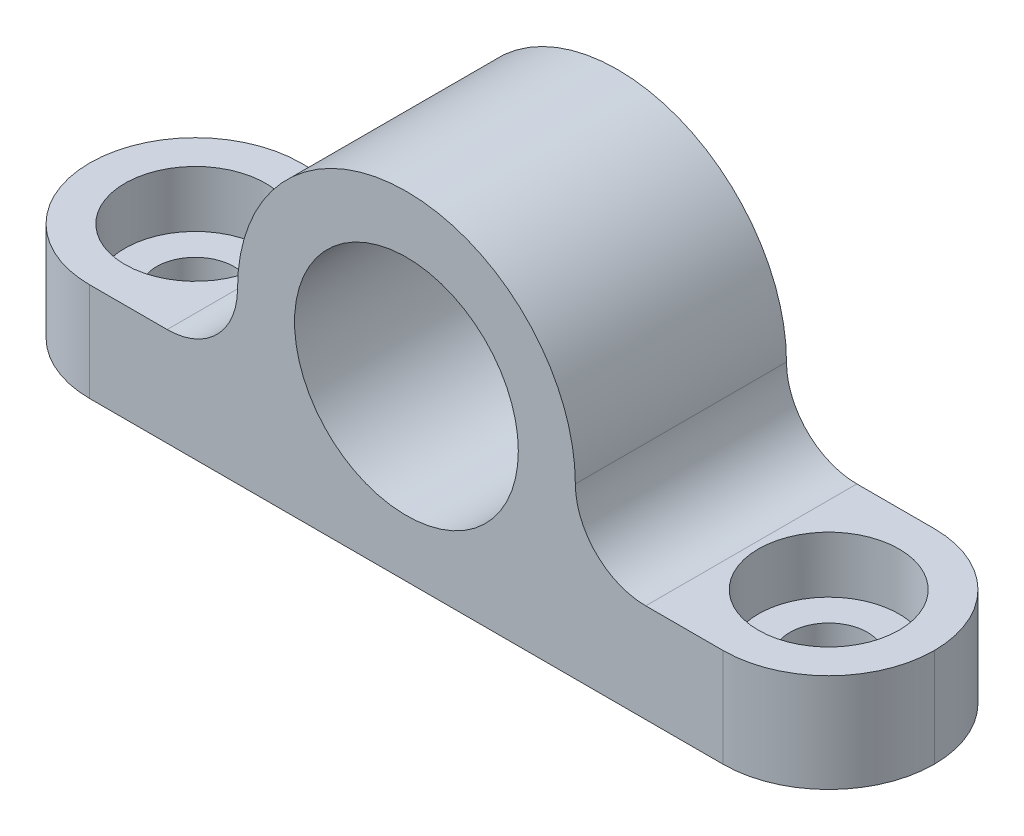
ISO-10303-21;
HEADER;
FILE_DESCRIPTION(('STEP AP214'),'2;1');
FILE_NAME('part.step','',(''),(''),'','','');
FILE_SCHEMA(('AUTOMOTIVE_DESIGN { 1 0 10303 214 1 1 1 1 }'));
ENDSEC;
DATA;
#1=APPLICATION_CONTEXT('core data for automotive mechanical design processes');
#2=APPLICATION_PROTOCOL_DEFINITION('international standard','automotive_design',2000,#1);
#3=PRODUCT_CONTEXT('',#1,'mechanical');
#4=PRODUCT('Part','Part','',(#3));
#5=PRODUCT_RELATED_PRODUCT_CATEGORY('part','',(#4));
#6=PRODUCT_DEFINITION_FORMATION('','',#4);
#7=PRODUCT_DEFINITION_CONTEXT('part definition',#1,'design');
#8=PRODUCT_DEFINITION('design','',#6,#7);
#9=PRODUCT_DEFINITION_SHAPE('','',#8);
#10=(LENGTH_UNIT() NAMED_UNIT(*) SI_UNIT(.MILLI.,.METRE.));
#11=(NAMED_UNIT(*) PLANE_ANGLE_UNIT() SI_UNIT($,.RADIAN.));
#12=(NAMED_UNIT(*) SI_UNIT($,.STERADIAN.) SOLID_ANGLE_UNIT());
#13=UNCERTAINTY_MEASURE_WITH_UNIT(LENGTH_MEASURE(1.E-05),#10,'distance_accuracy_value','');
#14=(GEOMETRIC_REPRESENTATION_CONTEXT(3) GLOBAL_UNCERTAINTY_ASSIGNED_CONTEXT((#13)) GLOBAL_UNIT_ASSIGNED_CONTEXT((#10,
#11,#12)) REPRESENTATION_CONTEXT('',''));
#15=CARTESIAN_POINT('',(0.,0.,0.));
#16=DIRECTION('',(0.,0.,1.));
#17=DIRECTION('',(1.,0.,0.));
#18=AXIS2_PLACEMENT_3D('',#15,#16,#17);
#19=CARTESIAN_POINT('',(30.,7.,7.5));
#20=DIRECTION('',(0.,1.,0.));
#21=DIRECTION('',(0.,0.,1.));
#22=AXIS2_PLACEMENT_3D('',#19,#20,#21);
#23=PLANE('',#22);
#24=CARTESIAN_POINT('',(-22.5,7.,0.));
#25=DIRECTION('',(0.,1.,0.));
#26=DIRECTION('',(0.,0.,1.));
#27=AXIS2_PLACEMENT_3D('',#24,#25,#26);
#28=CIRCLE('',#27,5.);
#29=CARTESIAN_POINT('',(-22.5,7.,5.));
#30=VERTEX_POINT('',#29);
#31=EDGE_CURVE('E157',#30,#30,#28,.T.);
#32=ORIENTED_EDGE('',*,*,#31,.F.);
#33=EDGE_LOOP('',(#32));
#34=FACE_BOUND('',#33,.T.);
#35=DIRECTION('',(-1.,0.,0.));
#36=VECTOR('',#35,1.);
#37=CARTESIAN_POINT('',(-30.,7.,-7.5));
#38=LINE('',#37,#36);
#39=CARTESIAN_POINT('',(-17.,7.,-7.5));
#40=VERTEX_POINT('',#39);
#41=CARTESIAN_POINT('',(-22.5,7.,-7.5));
#42=VERTEX_POINT('',#41);
#43=EDGE_CURVE('E173',#40,#42,#38,.T.);
#44=ORIENTED_EDGE('',*,*,#43,.T.);
#45=CARTESIAN_POINT('',(-22.5,7.,0.));
#46=DIRECTION('',(0.,1.,0.));
#47=DIRECTION('',(0.,0.,1.));
#48=AXIS2_PLACEMENT_3D('',#45,#46,#47);
#49=CIRCLE('',#48,7.5);
#50=CARTESIAN_POINT('',(-30.,7.,0.));
#51=VERTEX_POINT('',#50);
#52=EDGE_CURVE('E12',#42,#51,#49,.T.);
#53=ORIENTED_EDGE('',*,*,#52,.T.);
#54=CARTESIAN_POINT('',(-22.5,7.,0.));
#55=DIRECTION('',(0.,1.,0.));
#56=DIRECTION('',(0.,0.,1.));
#57=AXIS2_PLACEMENT_3D('',#54,#55,#56);
#58=CIRCLE('',#57,7.5);
#59=CARTESIAN_POINT('',(-22.5,7.,7.5));
#60=VERTEX_POINT('',#59);
#61=EDGE_CURVE('E44',#51,#60,#58,.T.);
#62=ORIENTED_EDGE('',*,*,#61,.T.);
#63=DIRECTION('',(1.,0.,0.));
#64=VECTOR('',#63,1.);
#65=CARTESIAN_POINT('',(-30.,7.,7.5));
#66=LINE('',#65,#64);
#67=CARTESIAN_POINT('',(-17.,7.,7.5));
#68=VERTEX_POINT('',#67);
#69=EDGE_CURVE('E174',#60,#68,#66,.T.);
#70=ORIENTED_EDGE('',*,*,#69,.T.);
#71=DIRECTION('',(0.,0.,1.));
#72=VECTOR('',#71,1.);
#73=CARTESIAN_POINT('',(-17.,7.,-45.5131556174964));
#74=LINE('',#73,#72);
#75=EDGE_CURVE('E141',#40,#68,#74,.T.);
#76=ORIENTED_EDGE('',*,*,#75,.F.);
#77=EDGE_LOOP('',(#44,#53,#62,#70,#76));
#78=FACE_BOUND('',#77,.T.);
#79=ADVANCED_FACE('F35',(#34,#78),#23,.T.);
#80=CARTESIAN_POINT('',(22.5,0.,0.));
#81=DIRECTION('',(0.,1.,0.));
#82=DIRECTION('',(0.,0.,1.));
#83=AXIS2_PLACEMENT_3D('',#80,#81,#82);
#84=CYLINDRICAL_SURFACE('',#83,2.75);
#85=CARTESIAN_POINT('',(22.5,0.,0.));
#86=DIRECTION('',(0.,1.,0.));
#87=DIRECTION('',(0.,0.,-1.));
#88=AXIS2_PLACEMENT_3D('',#85,#86,#87);
#89=CIRCLE('',#88,2.75);
#90=CARTESIAN_POINT('',(22.5,0.,-2.75));
#91=VERTEX_POINT('',#90);
#92=EDGE_CURVE('E164',#91,#91,#89,.T.);
#93=ORIENTED_EDGE('',*,*,#92,.F.);
#94=EDGE_LOOP('',(#93));
#95=FACE_BOUND('',#94,.T.);
#96=CARTESIAN_POINT('',(22.5,3.,0.));
#97=DIRECTION('',(0.,1.,0.));
#98=DIRECTION('',(0.,0.,1.));
#99=AXIS2_PLACEMENT_3D('',#96,#97,#98);
#100=CIRCLE('',#99,2.75);
#101=CARTESIAN_POINT('',(22.5,3.,2.75));
#102=VERTEX_POINT('',#101);
#103=EDGE_CURVE('E156',#102,#102,#100,.F.);
#104=ORIENTED_EDGE('',*,*,#103,.F.);
#105=EDGE_LOOP('',(#104));
#106=FACE_BOUND('',#105,.T.);
#107=ADVANCED_FACE('F255',(#95,#106),#84,.F.);
#108=CARTESIAN_POINT('',(-22.5,0.,0.));
#109=DIRECTION('',(0.,1.,0.));
#110=DIRECTION('',(0.,0.,1.));
#111=AXIS2_PLACEMENT_3D('',#108,#109,#110);
#112=CYLINDRICAL_SURFACE('',#111,2.75);
#113=CARTESIAN_POINT('',(-22.5,0.,0.));
#114=DIRECTION('',(0.,1.,0.));
#115=DIRECTION('',(0.,0.,1.));
#116=AXIS2_PLACEMENT_3D('',#113,#114,#115);
#117=CIRCLE('',#116,2.75);
#118=CARTESIAN_POINT('',(-22.5,0.,2.75));
#119=VERTEX_POINT('',#118);
#120=EDGE_CURVE('E167',#119,#119,#117,.T.);
#121=ORIENTED_EDGE('',*,*,#120,.F.);
#122=EDGE_LOOP('',(#121));
#123=FACE_BOUND('',#122,.T.);
#124=CARTESIAN_POINT('',(-22.5,3.,0.));
#125=DIRECTION('',(0.,1.,0.));
#126=DIRECTION('',(0.,0.,1.));
#127=AXIS2_PLACEMENT_3D('',#124,#125,#126);
#128=CIRCLE('',#127,2.75);
#129=CARTESIAN_POINT('',(-22.5,3.,2.75));
#130=VERTEX_POINT('',#129);
#131=EDGE_CURVE('E163',#130,#130,#128,.F.);
#132=ORIENTED_EDGE('',*,*,#131,.F.);
#133=EDGE_LOOP('',(#132));
#134=FACE_BOUND('',#133,.T.);
#135=ADVANCED_FACE('F261',(#123,#134),#112,.F.);
#136=CARTESIAN_POINT('',(-30.,7.,-7.5));
#137=DIRECTION('',(0.,0.,1.));
#138=DIRECTION('',(1.,0.,0.));
#139=AXIS2_PLACEMENT_3D('',#136,#137,#138);
#140=PLANE('',#139);
#141=CARTESIAN_POINT('',(0.,12.,-7.50000000000001));
#142=DIRECTION('',(0.,0.,1.));
#143=DIRECTION('',(1.,0.,0.));
#144=AXIS2_PLACEMENT_3D('',#141,#142,#143);
#145=CIRCLE('',#144,7.9500000000007);
#146=CARTESIAN_POINT('',(7.9500000000007,12.,-7.50000000000001));
#147=VERTEX_POINT('',#146);
#148=EDGE_CURVE('E211',#147,#147,#145,.T.);
#149=ORIENTED_EDGE('',*,*,#148,.T.);
#150=EDGE_LOOP('',(#149));
#151=FACE_BOUND('',#150,.T.);
#152=CARTESIAN_POINT('',(22.5,7.,-7.5));
#153=VERTEX_POINT('',#152);
#154=CARTESIAN_POINT('',(17.,7.,-7.5));
#155=VERTEX_POINT('',#154);
#156=EDGE_CURVE('E171',#153,#155,#38,.T.);
#157=ORIENTED_EDGE('',*,*,#156,.F.);
#158=DIRECTION('',(0.,-1.,0.));
#159=VECTOR('',#158,1.);
#160=CARTESIAN_POINT('',(22.5,7.,-7.5));
#161=LINE('',#160,#159);
#162=CARTESIAN_POINT('',(22.5,0.,-7.5));
#163=VERTEX_POINT('',#162);
#164=EDGE_CURVE('E202',#153,#163,#161,.T.);
#165=ORIENTED_EDGE('',*,*,#164,.T.);
#166=DIRECTION('',(-1.,0.,0.));
#167=VECTOR('',#166,1.);
#168=CARTESIAN_POINT('',(-30.,0.,-7.5));
#169=LINE('',#168,#167);
#170=CARTESIAN_POINT('',(-22.5,0.,-7.5));
#171=VERTEX_POINT('',#170);
#172=EDGE_CURVE('E170',#163,#171,#169,.T.);
#173=ORIENTED_EDGE('',*,*,#172,.T.);
#174=DIRECTION('',(0.,-1.,0.));
#175=VECTOR('',#174,1.);
#176=CARTESIAN_POINT('',(-22.5,7.,-7.5));
#177=LINE('',#176,#175);
#178=EDGE_CURVE('E200',#171,#42,#177,.F.);
#179=ORIENTED_EDGE('',*,*,#178,.T.);
#180=ORIENTED_EDGE('',*,*,#43,.F.);
#181=CARTESIAN_POINT('',(-17.,12.,-7.5));
#182=DIRECTION('',(0.,0.,1.));
#183=DIRECTION('',(1.,0.,0.));
#184=AXIS2_PLACEMENT_3D('',#181,#182,#183);
#185=CIRCLE('',#184,5.);
#186=CARTESIAN_POINT('',(-12.,12.,-7.5));
#187=VERTEX_POINT('',#186);
#188=EDGE_CURVE('E153',#40,#187,#185,.T.);
#189=ORIENTED_EDGE('',*,*,#188,.T.);
#190=CARTESIAN_POINT('',(0.,12.,-7.5));
#191=DIRECTION('',(0.,0.,1.));
#192=DIRECTION('',(1.,0.,0.));
#193=AXIS2_PLACEMENT_3D('',#190,#191,#192);
#194=CIRCLE('',#193,12.);
#195=CARTESIAN_POINT('',(12.,12.,-7.5));
#196=VERTEX_POINT('',#195);
#197=EDGE_CURVE('E227',#187,#196,#194,.F.);
#198=ORIENTED_EDGE('',*,*,#197,.T.);
#199=CARTESIAN_POINT('',(17.,12.,-7.5));
#200=DIRECTION('',(0.,0.,1.));
#201=DIRECTION('',(1.,0.,0.));
#202=AXIS2_PLACEMENT_3D('',#199,#200,#201);
#203=CIRCLE('',#202,5.);
#204=EDGE_CURVE('E119',#196,#155,#203,.T.);
#205=ORIENTED_EDGE('',*,*,#204,.T.);
#206=EDGE_LOOP('',(#157,#165,#173,#179,#180,#189,#198,#205));
#207=FACE_BOUND('',#206,.T.);
#208=ADVANCED_FACE('F231',(#151,#207),#140,.F.);
#209=CARTESIAN_POINT('',(-30.,7.,7.5));
#210=DIRECTION('',(0.,0.,-1.));
#211=DIRECTION('',(-1.,0.,0.));
#212=AXIS2_PLACEMENT_3D('',#209,#210,#211);
#213=PLANE('',#212);
#214=CARTESIAN_POINT('',(0.,12.,7.5));
#215=DIRECTION('',(0.,0.,1.));
#216=DIRECTION('',(1.,0.,0.));
#217=AXIS2_PLACEMENT_3D('',#214,#215,#216);
#218=CIRCLE('',#217,7.9500000000007);
#219=CARTESIAN_POINT('',(7.9500000000007,12.,7.5));
#220=VERTEX_POINT('',#219);
#221=EDGE_CURVE('E206',#220,#220,#218,.T.);
#222=ORIENTED_EDGE('',*,*,#221,.F.);
#223=EDGE_LOOP('',(#222));
#224=FACE_BOUND('',#223,.T.);
#225=DIRECTION('',(1.,0.,0.));
#226=VECTOR('',#225,1.);
#227=CARTESIAN_POINT('',(-30.,0.,7.5));
#228=LINE('',#227,#226);
#229=CARTESIAN_POINT('',(-22.5,0.,7.5));
#230=VERTEX_POINT('',#229);
#231=CARTESIAN_POINT('',(22.5,0.,7.5));
#232=VERTEX_POINT('',#231);
#233=EDGE_CURVE('E179',#230,#232,#228,.T.);
#234=ORIENTED_EDGE('',*,*,#233,.T.);
#235=DIRECTION('',(0.,-1.,0.));
#236=VECTOR('',#235,1.);
#237=CARTESIAN_POINT('',(22.5,7.,7.5));
#238=LINE('',#237,#236);
#239=CARTESIAN_POINT('',(22.5,7.,7.5));
#240=VERTEX_POINT('',#239);
#241=EDGE_CURVE('E194',#232,#240,#238,.F.);
#242=ORIENTED_EDGE('',*,*,#241,.T.);
#243=CARTESIAN_POINT('',(17.,7.,7.5));
#244=VERTEX_POINT('',#243);
#245=EDGE_CURVE('E135',#244,#240,#66,.T.);
#246=ORIENTED_EDGE('',*,*,#245,.F.);
#247=CARTESIAN_POINT('',(17.,12.,7.5));
#248=DIRECTION('',(0.,0.,-1.));
#249=DIRECTION('',(1.,0.,0.));
#250=AXIS2_PLACEMENT_3D('',#247,#248,#249);
#251=CIRCLE('',#250,5.);
#252=CARTESIAN_POINT('',(12.,12.,7.5));
#253=VERTEX_POINT('',#252);
#254=EDGE_CURVE('E117',#244,#253,#251,.T.);
#255=ORIENTED_EDGE('',*,*,#254,.T.);
#256=CARTESIAN_POINT('',(0.,12.,7.5));
#257=DIRECTION('',(0.,0.,1.));
#258=DIRECTION('',(-1.,0.,0.));
#259=AXIS2_PLACEMENT_3D('',#256,#257,#258);
#260=CIRCLE('',#259,12.);
#261=CARTESIAN_POINT('',(-12.,12.,7.5));
#262=VERTEX_POINT('',#261);
#263=EDGE_CURVE('E132',#253,#262,#260,.T.);
#264=ORIENTED_EDGE('',*,*,#263,.T.);
#265=CARTESIAN_POINT('',(-17.,12.,7.5));
#266=DIRECTION('',(0.,0.,-1.));
#267=DIRECTION('',(-1.,0.,0.));
#268=AXIS2_PLACEMENT_3D('',#265,#266,#267);
#269=CIRCLE('',#268,5.);
#270=EDGE_CURVE('E136',#262,#68,#269,.T.);
#271=ORIENTED_EDGE('',*,*,#270,.T.);
#272=ORIENTED_EDGE('',*,*,#69,.F.);
#273=DIRECTION('',(0.,-1.,0.));
#274=VECTOR('',#273,1.);
#275=CARTESIAN_POINT('',(-22.5,7.,7.5));
#276=LINE('',#275,#274);
#277=EDGE_CURVE('E192',#60,#230,#276,.T.);
#278=ORIENTED_EDGE('',*,*,#277,.T.);
#279=EDGE_LOOP('',(#234,#242,#246,#255,#264,#271,#272,#278));
#280=FACE_BOUND('',#279,.T.);
#281=ADVANCED_FACE('F130',(#224,#280),#213,.F.);
#282=ORIENTED_EDGE('',*,*,#245,.T.);
#283=CARTESIAN_POINT('',(22.5,7.,0.));
#284=DIRECTION('',(0.,1.,0.));
#285=DIRECTION('',(0.,0.,1.));
#286=AXIS2_PLACEMENT_3D('',#283,#284,#285);
#287=CIRCLE('',#286,7.5);
#288=CARTESIAN_POINT('',(30.,7.,0.));
#289=VERTEX_POINT('',#288);
#290=EDGE_CURVE('E198',#240,#289,#287,.T.);
#291=ORIENTED_EDGE('',*,*,#290,.T.);
#292=CARTESIAN_POINT('',(22.5,7.,0.));
#293=DIRECTION('',(0.,1.,0.));
#294=DIRECTION('',(0.,0.,1.));
#295=AXIS2_PLACEMENT_3D('',#292,#293,#294);
#296=CIRCLE('',#295,7.5);
#297=EDGE_CURVE('E196',#289,#153,#296,.T.);
#298=ORIENTED_EDGE('',*,*,#297,.T.);
#299=ORIENTED_EDGE('',*,*,#156,.T.);
#300=DIRECTION('',(0.,0.,1.));
#301=VECTOR('',#300,1.);
#302=CARTESIAN_POINT('',(17.,7.,-45.5131556174964));
#303=LINE('',#302,#301);
#304=EDGE_CURVE('E124',#155,#244,#303,.T.);
#305=ORIENTED_EDGE('',*,*,#304,.T.);
#306=EDGE_LOOP('',(#282,#291,#298,#299,#305));
#307=FACE_BOUND('',#306,.T.);
#308=CARTESIAN_POINT('',(22.5,7.,0.));
#309=DIRECTION('',(0.,1.,0.));
#310=DIRECTION('',(0.,0.,-1.));
#311=AXIS2_PLACEMENT_3D('',#308,#309,#310);
#312=CIRCLE('',#311,5.);
#313=CARTESIAN_POINT('',(22.5,7.,-5.));
#314=VERTEX_POINT('',#313);
#315=EDGE_CURVE('E149',#314,#314,#312,.T.);
#316=ORIENTED_EDGE('',*,*,#315,.F.);
#317=EDGE_LOOP('',(#316));
#318=FACE_BOUND('',#317,.T.);
#319=ADVANCED_FACE('F234',(#307,#318),#23,.T.);
#320=CARTESIAN_POINT('',(30.,0.,7.5));
#321=DIRECTION('',(0.,1.,0.));
#322=DIRECTION('',(0.,0.,1.));
#323=AXIS2_PLACEMENT_3D('',#320,#321,#322);
#324=PLANE('',#323);
#325=ORIENTED_EDGE('',*,*,#92,.T.);
#326=EDGE_LOOP('',(#325));
#327=FACE_BOUND('',#326,.T.);
#328=ORIENTED_EDGE('',*,*,#120,.T.);
#329=EDGE_LOOP('',(#328));
#330=FACE_BOUND('',#329,.T.);
#331=CARTESIAN_POINT('',(22.5,0.,0.));
#332=DIRECTION('',(0.,1.,0.));
#333=DIRECTION('',(0.,0.,1.));
#334=AXIS2_PLACEMENT_3D('',#331,#332,#333);
#335=CIRCLE('',#334,7.5);
#336=CARTESIAN_POINT('',(30.,0.,0.));
#337=VERTEX_POINT('',#336);
#338=EDGE_CURVE('E188',#163,#337,#335,.F.);
#339=ORIENTED_EDGE('',*,*,#338,.T.);
#340=CARTESIAN_POINT('',(22.5,0.,0.));
#341=DIRECTION('',(0.,1.,0.));
#342=DIRECTION('',(0.,0.,1.));
#343=AXIS2_PLACEMENT_3D('',#340,#341,#342);
#344=CIRCLE('',#343,7.5);
#345=EDGE_CURVE('E190',#337,#232,#344,.F.);
#346=ORIENTED_EDGE('',*,*,#345,.T.);
#347=ORIENTED_EDGE('',*,*,#233,.F.);
#348=CARTESIAN_POINT('',(-22.5,0.,0.));
#349=DIRECTION('',(0.,1.,0.));
#350=DIRECTION('',(0.,0.,1.));
#351=AXIS2_PLACEMENT_3D('',#348,#349,#350);
#352=CIRCLE('',#351,7.5);
#353=CARTESIAN_POINT('',(-30.,0.,0.));
#354=VERTEX_POINT('',#353);
#355=EDGE_CURVE('E176',#230,#354,#352,.F.);
#356=ORIENTED_EDGE('',*,*,#355,.T.);
#357=CARTESIAN_POINT('',(-22.5,0.,0.));
#358=DIRECTION('',(0.,1.,0.));
#359=DIRECTION('',(0.,0.,1.));
#360=AXIS2_PLACEMENT_3D('',#357,#358,#359);
#361=CIRCLE('',#360,7.5);
#362=EDGE_CURVE('E186',#354,#171,#361,.F.);
#363=ORIENTED_EDGE('',*,*,#362,.T.);
#364=ORIENTED_EDGE('',*,*,#172,.F.);
#365=EDGE_LOOP('',(#339,#346,#347,#356,#363,#364));
#366=FACE_BOUND('',#365,.T.);
#367=ADVANCED_FACE('F242',(#327,#330,#366),#324,.F.);
#368=CARTESIAN_POINT('',(30.,3.,7.5));
#369=DIRECTION('',(0.,1.,0.));
#370=DIRECTION('',(0.,0.,1.));
#371=AXIS2_PLACEMENT_3D('',#368,#369,#370);
#372=PLANE('',#371);
#373=CARTESIAN_POINT('',(-22.5,3.,0.));
#374=DIRECTION('',(0.,1.,0.));
#375=DIRECTION('',(0.,0.,1.));
#376=AXIS2_PLACEMENT_3D('',#373,#374,#375);
#377=CIRCLE('',#376,5.);
#378=CARTESIAN_POINT('',(-22.5,3.,5.));
#379=VERTEX_POINT('',#378);
#380=EDGE_CURVE('E160',#379,#379,#377,.F.);
#381=ORIENTED_EDGE('',*,*,#380,.F.);
#382=EDGE_LOOP('',(#381));
#383=FACE_BOUND('',#382,.T.);
#384=ORIENTED_EDGE('',*,*,#131,.T.);
#385=EDGE_LOOP('',(#384));
#386=FACE_BOUND('',#385,.T.);
#387=ADVANCED_FACE('F272',(#383,#386),#372,.T.);
#388=CARTESIAN_POINT('',(-22.5,-14.142135623731,0.));
#389=DIRECTION('',(0.,1.,0.));
#390=DIRECTION('',(0.,0.,1.));
#391=AXIS2_PLACEMENT_3D('',#388,#389,#390);
#392=CYLINDRICAL_SURFACE('',#391,5.);
#393=ORIENTED_EDGE('',*,*,#380,.T.);
#394=EDGE_LOOP('',(#393));
#395=FACE_BOUND('',#394,.T.);
#396=ORIENTED_EDGE('',*,*,#31,.T.);
#397=EDGE_LOOP('',(#396));
#398=FACE_BOUND('',#397,.T.);
#399=ADVANCED_FACE('F300',(#395,#398),#392,.F.);
#400=CARTESIAN_POINT('',(30.,3.,7.5));
#401=DIRECTION('',(0.,1.,0.));
#402=DIRECTION('',(0.,0.,1.));
#403=AXIS2_PLACEMENT_3D('',#400,#401,#402);
#404=PLANE('',#403);
#405=CARTESIAN_POINT('',(22.5,3.,0.));
#406=DIRECTION('',(0.,1.,0.));
#407=DIRECTION('',(0.,0.,1.));
#408=AXIS2_PLACEMENT_3D('',#405,#406,#407);
#409=CIRCLE('',#408,5.);
#410=CARTESIAN_POINT('',(22.5,3.,5.));
#411=VERTEX_POINT('',#410);
#412=EDGE_CURVE('E152',#411,#411,#409,.F.);
#413=ORIENTED_EDGE('',*,*,#412,.F.);
#414=EDGE_LOOP('',(#413));
#415=FACE_BOUND('',#414,.T.);
#416=ORIENTED_EDGE('',*,*,#103,.T.);
#417=EDGE_LOOP('',(#416));
#418=FACE_BOUND('',#417,.T.);
#419=ADVANCED_FACE('F297',(#415,#418),#404,.T.);
#420=CARTESIAN_POINT('',(22.5,-14.142135623731,0.));
#421=DIRECTION('',(0.,1.,0.));
#422=DIRECTION('',(0.,0.,1.));
#423=AXIS2_PLACEMENT_3D('',#420,#421,#422);
#424=CYLINDRICAL_SURFACE('',#423,5.);
#425=ORIENTED_EDGE('',*,*,#412,.T.);
#426=EDGE_LOOP('',(#425));
#427=FACE_BOUND('',#426,.T.);
#428=ORIENTED_EDGE('',*,*,#315,.T.);
#429=EDGE_LOOP('',(#428));
#430=FACE_BOUND('',#429,.T.);
#431=ADVANCED_FACE('F296',(#427,#430),#424,.F.);
#432=CARTESIAN_POINT('',(-17.,12.,-45.5131556174964));
#433=DIRECTION('',(0.,0.,1.));
#434=DIRECTION('',(1.,0.,0.));
#435=AXIS2_PLACEMENT_3D('',#432,#433,#434);
#436=CYLINDRICAL_SURFACE('',#435,5.);
#437=ORIENTED_EDGE('',*,*,#188,.F.);
#438=ORIENTED_EDGE('',*,*,#75,.T.);
#439=ORIENTED_EDGE('',*,*,#270,.F.);
#440=DIRECTION('',(0.,0.,1.));
#441=VECTOR('',#440,1.);
#442=CARTESIAN_POINT('',(-12.,12.,-45.5131556174964));
#443=LINE('',#442,#441);
#444=EDGE_CURVE('E123',#187,#262,#443,.T.);
#445=ORIENTED_EDGE('',*,*,#444,.F.);
#446=EDGE_LOOP('',(#437,#438,#439,#445));
#447=FACE_BOUND('',#446,.T.);
#448=ADVANCED_FACE('F292',(#447),#436,.F.);
#449=CARTESIAN_POINT('',(0.,12.,-45.5131556174964));
#450=DIRECTION('',(0.,0.,1.));
#451=DIRECTION('',(1.,0.,0.));
#452=AXIS2_PLACEMENT_3D('',#449,#450,#451);
#453=CYLINDRICAL_SURFACE('',#452,12.);
#454=ORIENTED_EDGE('',*,*,#197,.F.);
#455=ORIENTED_EDGE('',*,*,#444,.T.);
#456=ORIENTED_EDGE('',*,*,#263,.F.);
#457=DIRECTION('',(0.,0.,1.));
#458=VECTOR('',#457,1.);
#459=CARTESIAN_POINT('',(12.,12.,-45.5131556174964));
#460=LINE('',#459,#458);
#461=EDGE_CURVE('E113',#196,#253,#460,.T.);
#462=ORIENTED_EDGE('',*,*,#461,.F.);
#463=EDGE_LOOP('',(#454,#455,#456,#462));
#464=FACE_BOUND('',#463,.T.);
#465=ADVANCED_FACE('F138',(#464),#453,.T.);
#466=CARTESIAN_POINT('',(17.,12.,-45.5131556174964));
#467=DIRECTION('',(0.,0.,1.));
#468=DIRECTION('',(1.,0.,0.));
#469=AXIS2_PLACEMENT_3D('',#466,#467,#468);
#470=CYLINDRICAL_SURFACE('',#469,5.);
#471=ORIENTED_EDGE('',*,*,#204,.F.);
#472=ORIENTED_EDGE('',*,*,#461,.T.);
#473=ORIENTED_EDGE('',*,*,#254,.F.);
#474=ORIENTED_EDGE('',*,*,#304,.F.);
#475=EDGE_LOOP('',(#471,#472,#473,#474));
#476=FACE_BOUND('',#475,.T.);
#477=ADVANCED_FACE('F115',(#476),#470,.F.);
#478=CARTESIAN_POINT('',(0.,12.,-7.50000000000001));
#479=DIRECTION('',(0.,0.,1.));
#480=DIRECTION('',(1.,0.,0.));
#481=AXIS2_PLACEMENT_3D('',#478,#479,#480);
#482=CYLINDRICAL_SURFACE('',#481,7.9500000000007);
#483=ORIENTED_EDGE('',*,*,#148,.F.);
#484=EDGE_LOOP('',(#483));
#485=FACE_BOUND('',#484,.T.);
#486=ORIENTED_EDGE('',*,*,#221,.T.);
#487=EDGE_LOOP('',(#486));
#488=FACE_BOUND('',#487,.T.);
#489=ADVANCED_FACE('F251',(#485,#488),#482,.F.);
#490=CARTESIAN_POINT('',(22.5,7.,0.));
#491=DIRECTION('',(0.,-1.,0.));
#492=DIRECTION('',(0.,0.,-1.));
#493=AXIS2_PLACEMENT_3D('',#490,#491,#492);
#494=CYLINDRICAL_SURFACE('',#493,7.5);
#495=ORIENTED_EDGE('',*,*,#164,.F.);
#496=ORIENTED_EDGE('',*,*,#297,.F.);
#497=DIRECTION('',(0.,-1.,0.));
#498=VECTOR('',#497,1.);
#499=CARTESIAN_POINT('',(30.,7.,0.));
#500=LINE('',#499,#498);
#501=EDGE_CURVE('E204',#337,#289,#500,.F.);
#502=ORIENTED_EDGE('',*,*,#501,.F.);
#503=ORIENTED_EDGE('',*,*,#338,.F.);
#504=EDGE_LOOP('',(#495,#496,#502,#503));
#505=FACE_BOUND('',#504,.T.);
#506=ADVANCED_FACE('F238',(#505),#494,.T.);
#507=CARTESIAN_POINT('',(22.5,7.,0.));
#508=DIRECTION('',(0.,-1.,0.));
#509=DIRECTION('',(0.,0.,-1.));
#510=AXIS2_PLACEMENT_3D('',#507,#508,#509);
#511=CYLINDRICAL_SURFACE('',#510,7.5);
#512=ORIENTED_EDGE('',*,*,#290,.F.);
#513=ORIENTED_EDGE('',*,*,#241,.F.);
#514=ORIENTED_EDGE('',*,*,#345,.F.);
#515=ORIENTED_EDGE('',*,*,#501,.T.);
#516=EDGE_LOOP('',(#512,#513,#514,#515));
#517=FACE_BOUND('',#516,.T.);
#518=ADVANCED_FACE('F244',(#517),#511,.T.);
#519=CARTESIAN_POINT('',(-22.5,7.,0.));
#520=DIRECTION('',(0.,-1.,0.));
#521=DIRECTION('',(0.,0.,-1.));
#522=AXIS2_PLACEMENT_3D('',#519,#520,#521);
#523=CYLINDRICAL_SURFACE('',#522,7.5);
#524=ORIENTED_EDGE('',*,*,#277,.F.);
#525=ORIENTED_EDGE('',*,*,#61,.F.);
#526=DIRECTION('',(0.,-1.,0.));
#527=VECTOR('',#526,1.);
#528=CARTESIAN_POINT('',(-30.,7.,0.));
#529=LINE('',#528,#527);
#530=EDGE_CURVE('E39',#354,#51,#529,.F.);
#531=ORIENTED_EDGE('',*,*,#530,.F.);
#532=ORIENTED_EDGE('',*,*,#355,.F.);
#533=EDGE_LOOP('',(#524,#525,#531,#532));
#534=FACE_BOUND('',#533,.T.);
#535=ADVANCED_FACE('F37',(#534),#523,.T.);
#536=CARTESIAN_POINT('',(-22.5,7.,0.));
#537=DIRECTION('',(0.,-1.,0.));
#538=DIRECTION('',(0.,0.,-1.));
#539=AXIS2_PLACEMENT_3D('',#536,#537,#538);
#540=CYLINDRICAL_SURFACE('',#539,7.5);
#541=ORIENTED_EDGE('',*,*,#52,.F.);
#542=ORIENTED_EDGE('',*,*,#178,.F.);
#543=ORIENTED_EDGE('',*,*,#362,.F.);
#544=ORIENTED_EDGE('',*,*,#530,.T.);
#545=EDGE_LOOP('',(#541,#542,#543,#544));
#546=FACE_BOUND('',#545,.T.);
#547=ADVANCED_FACE('F215',(#546),#540,.T.);
#548=CLOSED_SHELL('',(#79,#107,#135,#208,#281,#319,#367,#387,#399,#419,#431,#448,#465,#477,#489,
#506,#518,#535,#547));
#549=MANIFOLD_SOLID_BREP('B2',#548);
#550=ADVANCED_BREP_SHAPE_REPRESENTATION('',(#18,#549),#14);
#551=SHAPE_DEFINITION_REPRESENTATION(#9,#550);
ENDSEC;
END-ISO-10303-21;
